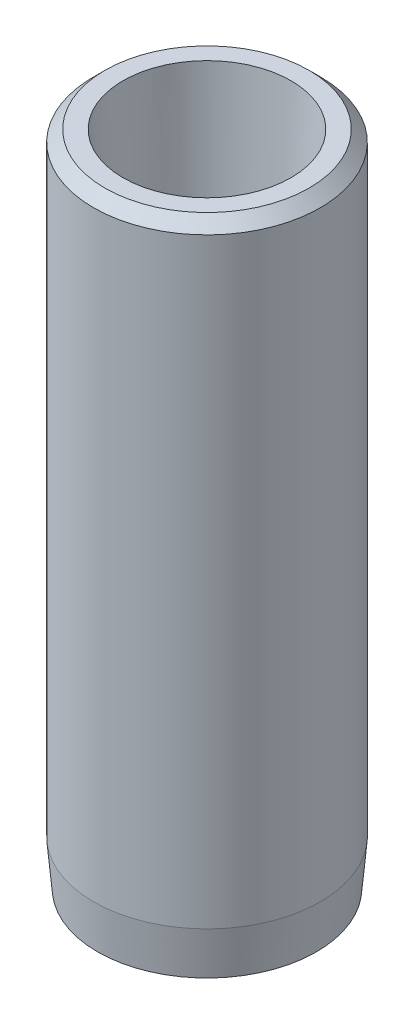
ISO-10303-21;
HEADER;
FILE_DESCRIPTION(('STEP AP214'),'2;1');
FILE_NAME('part.step','',(''),(''),'','','');
FILE_SCHEMA(('AUTOMOTIVE_DESIGN { 1 0 10303 214 1 1 1 1 }'));
ENDSEC;
DATA;
#1=APPLICATION_CONTEXT('core data for automotive mechanical design processes');
#2=APPLICATION_PROTOCOL_DEFINITION('international standard','automotive_design',2000,#1);
#3=PRODUCT_CONTEXT('',#1,'mechanical');
#4=PRODUCT('Part','Part','',(#3));
#5=PRODUCT_RELATED_PRODUCT_CATEGORY('part','',(#4));
#6=PRODUCT_DEFINITION_FORMATION('','',#4);
#7=PRODUCT_DEFINITION_CONTEXT('part definition',#1,'design');
#8=PRODUCT_DEFINITION('design','',#6,#7);
#9=PRODUCT_DEFINITION_SHAPE('','',#8);
#10=(LENGTH_UNIT() NAMED_UNIT(*) SI_UNIT(.MILLI.,.METRE.));
#11=(NAMED_UNIT(*) PLANE_ANGLE_UNIT() SI_UNIT($,.RADIAN.));
#12=(NAMED_UNIT(*) SI_UNIT($,.STERADIAN.) SOLID_ANGLE_UNIT());
#13=UNCERTAINTY_MEASURE_WITH_UNIT(LENGTH_MEASURE(1.E-05),#10,'distance_accuracy_value','');
#14=(GEOMETRIC_REPRESENTATION_CONTEXT(3) GLOBAL_UNCERTAINTY_ASSIGNED_CONTEXT((#13)) GLOBAL_UNIT_ASSIGNED_CONTEXT((#10,
#11,#12)) REPRESENTATION_CONTEXT('',''));
#15=CARTESIAN_POINT('',(0.,0.,0.));
#16=DIRECTION('',(0.,0.,1.));
#17=DIRECTION('',(1.,0.,0.));
#18=AXIS2_PLACEMENT_3D('',#15,#16,#17);
#19=CARTESIAN_POINT('',(0.,29.,0.));
#20=DIRECTION('',(0.,1.,0.));
#21=DIRECTION('',(0.,0.,1.));
#22=AXIS2_PLACEMENT_3D('',#19,#20,#21);
#23=PLANE('',#22);
#24=CARTESIAN_POINT('',(0.,29.,0.));
#25=DIRECTION('',(0.,1.,0.));
#26=DIRECTION('',(0.,0.,1.));
#27=AXIS2_PLACEMENT_3D('',#24,#25,#26);
#28=CIRCLE('',#27,4.50000000000002);
#29=CARTESIAN_POINT('',(0.,29.,4.50000000000002));
#30=VERTEX_POINT('',#29);
#31=EDGE_CURVE('E58',#30,#30,#28,.T.);
#32=ORIENTED_EDGE('',*,*,#31,.T.);
#33=EDGE_LOOP('',(#32));
#34=FACE_BOUND('',#33,.T.);
#35=CARTESIAN_POINT('',(0.,29.,0.));
#36=DIRECTION('',(0.,-1.,0.));
#37=DIRECTION('',(0.,0.,1.));
#38=AXIS2_PLACEMENT_3D('',#35,#36,#37);
#39=CIRCLE('',#38,3.70537892350978);
#40=CARTESIAN_POINT('',(0.,29.,3.70537892350978));
#41=VERTEX_POINT('',#40);
#42=CARTESIAN_POINT('',(3.70537892350978,29.,0.));
#43=VERTEX_POINT('',#42);
#44=EDGE_CURVE('E83',#41,#43,#39,.T.);
#45=ORIENTED_EDGE('',*,*,#44,.T.);
#46=CARTESIAN_POINT('',(0.,29.,0.));
#47=DIRECTION('',(0.,-1.,0.));
#48=DIRECTION('',(1.,0.,0.));
#49=AXIS2_PLACEMENT_3D('',#46,#47,#48);
#50=CIRCLE('',#49,3.70537892350978);
#51=EDGE_CURVE('E84',#43,#41,#50,.T.);
#52=ORIENTED_EDGE('',*,*,#51,.T.);
#53=EDGE_LOOP('',(#45,#52));
#54=FACE_BOUND('',#53,.T.);
#55=ADVANCED_FACE('F49',(#34,#54),#23,.T.);
#56=CARTESIAN_POINT('',(0.,0.,0.));
#57=DIRECTION('',(0.,1.,0.));
#58=DIRECTION('',(0.,0.,1.));
#59=AXIS2_PLACEMENT_3D('',#56,#57,#58);
#60=PLANE('',#59);
#61=CARTESIAN_POINT('',(0.,0.,0.));
#62=DIRECTION('',(0.,1.,0.));
#63=DIRECTION('',(0.,0.,1.));
#64=AXIS2_PLACEMENT_3D('',#61,#62,#63);
#65=CIRCLE('',#64,4.82502267294818);
#66=CARTESIAN_POINT('',(0.,0.,4.82502267294818));
#67=VERTEX_POINT('',#66);
#68=EDGE_CURVE('E102',#67,#67,#65,.F.);
#69=ORIENTED_EDGE('',*,*,#68,.T.);
#70=EDGE_LOOP('',(#69));
#71=FACE_BOUND('',#70,.T.);
#72=CARTESIAN_POINT('',(0.,0.,0.));
#73=DIRECTION('',(0.,1.,0.));
#74=DIRECTION('',(0.,0.,1.));
#75=AXIS2_PLACEMENT_3D('',#72,#73,#74);
#76=CIRCLE('',#75,2.5);
#77=CARTESIAN_POINT('',(0.,0.,2.5));
#78=VERTEX_POINT('',#77);
#79=EDGE_CURVE('E96',#78,#78,#76,.T.);
#80=ORIENTED_EDGE('',*,*,#79,.T.);
#81=EDGE_LOOP('',(#80));
#82=FACE_BOUND('',#81,.T.);
#83=ADVANCED_FACE('F119',(#71,#82),#60,.F.);
#84=CARTESIAN_POINT('',(0.,29.,0.));
#85=DIRECTION('',(0.,-1.,0.));
#86=DIRECTION('',(0.,0.,-1.));
#87=AXIS2_PLACEMENT_3D('',#84,#85,#86);
#88=CYLINDRICAL_SURFACE('',#87,5.);
#89=CARTESIAN_POINT('',(0.,28.5,0.));
#90=DIRECTION('',(0.,1.,0.));
#91=DIRECTION('',(0.,0.,1.));
#92=AXIS2_PLACEMENT_3D('',#89,#90,#91);
#93=CIRCLE('',#92,5.);
#94=CARTESIAN_POINT('',(0.,28.5,-5.));
#95=VERTEX_POINT('',#94);
#96=EDGE_CURVE('E11',#95,#95,#93,.F.);
#97=CARTESIAN_POINT('',(0.,1.99999999999977,0.));
#98=DIRECTION('',(0.,1.,0.));
#99=DIRECTION('',(0.,0.,1.));
#100=AXIS2_PLACEMENT_3D('',#97,#98,#99);
#101=CIRCLE('',#100,5.);
#102=CARTESIAN_POINT('',(0.,1.99999999999977,-5.));
#103=VERTEX_POINT('',#102);
#104=EDGE_CURVE('E99',#103,#103,#101,.T.);
#105=CARTESIAN_POINT('',(0.,28.5,-5.));
#106=CARTESIAN_POINT('',(0.,28.2239583333333,-5.));
#107=CARTESIAN_POINT('',(0.,27.9479166666667,-5.));
#108=CARTESIAN_POINT('',(0.,27.3958333333333,-5.));
#109=CARTESIAN_POINT('',(0.,27.1197916666667,-5.));
#110=CARTESIAN_POINT('',(0.,26.5677083333333,-5.));
#111=CARTESIAN_POINT('',(0.,26.2916666666667,-5.));
#112=CARTESIAN_POINT('',(0.,25.7395833333333,-5.));
#113=CARTESIAN_POINT('',(0.,25.4635416666667,-5.));
#114=CARTESIAN_POINT('',(0.,24.9114583333333,-5.));
#115=CARTESIAN_POINT('',(0.,24.6354166666666,-5.));
#116=CARTESIAN_POINT('',(0.,24.0833333333333,-5.));
#117=CARTESIAN_POINT('',(0.,23.8072916666666,-5.));
#118=CARTESIAN_POINT('',(0.,23.2552083333333,-5.));
#119=CARTESIAN_POINT('',(0.,22.9791666666666,-5.));
#120=CARTESIAN_POINT('',(0.,22.4270833333333,-5.));
#121=CARTESIAN_POINT('',(0.,22.1510416666666,-5.));
#122=CARTESIAN_POINT('',(0.,21.5989583333333,-5.));
#123=CARTESIAN_POINT('',(0.,21.3229166666666,-5.));
#124=CARTESIAN_POINT('',(0.,20.7708333333333,-5.));
#125=CARTESIAN_POINT('',(0.,20.4947916666666,-5.));
#126=CARTESIAN_POINT('',(0.,19.9427083333333,-5.));
#127=CARTESIAN_POINT('',(0.,19.6666666666666,-5.));
#128=CARTESIAN_POINT('',(0.,19.1145833333333,-5.));
#129=CARTESIAN_POINT('',(0.,18.8385416666666,-5.));
#130=CARTESIAN_POINT('',(0.,18.2864583333333,-5.));
#131=CARTESIAN_POINT('',(0.,18.0104166666666,-5.));
#132=CARTESIAN_POINT('',(0.,17.4583333333332,-5.));
#133=CARTESIAN_POINT('',(0.,17.1822916666666,-5.));
#134=CARTESIAN_POINT('',(0.,16.6302083333332,-5.));
#135=CARTESIAN_POINT('',(0.,16.3541666666666,-5.));
#136=CARTESIAN_POINT('',(0.,15.8020833333332,-5.));
#137=CARTESIAN_POINT('',(0.,15.5260416666666,-5.));
#138=CARTESIAN_POINT('',(0.,14.9739583333332,-5.));
#139=CARTESIAN_POINT('',(0.,14.6979166666666,-5.));
#140=CARTESIAN_POINT('',(0.,14.1458333333332,-5.));
#141=CARTESIAN_POINT('',(0.,13.8697916666665,-5.));
#142=CARTESIAN_POINT('',(0.,13.3177083333332,-5.));
#143=CARTESIAN_POINT('',(0.,13.0416666666665,-5.));
#144=CARTESIAN_POINT('',(0.,12.4895833333332,-5.));
#145=CARTESIAN_POINT('',(0.,12.2135416666665,-5.));
#146=CARTESIAN_POINT('',(0.,11.6614583333332,-5.));
#147=CARTESIAN_POINT('',(0.,11.3854166666665,-5.));
#148=CARTESIAN_POINT('',(0.,10.8333333333332,-5.));
#149=CARTESIAN_POINT('',(0.,10.5572916666665,-5.));
#150=CARTESIAN_POINT('',(0.,10.0052083333332,-5.));
#151=CARTESIAN_POINT('',(0.,9.7291666666665,-5.));
#152=CARTESIAN_POINT('',(0.,9.17708333333316,-5.));
#153=CARTESIAN_POINT('',(0.,8.9010416666665,-5.));
#154=CARTESIAN_POINT('',(0.,8.34895833333316,-5.));
#155=CARTESIAN_POINT('',(0.,8.07291666666649,-5.));
#156=CARTESIAN_POINT('',(0.,7.52083333333315,-5.));
#157=CARTESIAN_POINT('',(0.,7.24479166666648,-5.));
#158=CARTESIAN_POINT('',(0.,6.69270833333314,-5.));
#159=CARTESIAN_POINT('',(0.,6.41666666666647,-5.));
#160=CARTESIAN_POINT('',(0.,5.86458333333313,-5.));
#161=CARTESIAN_POINT('',(0.,5.58854166666647,-5.));
#162=CARTESIAN_POINT('',(0.,5.03645833333313,-5.));
#163=CARTESIAN_POINT('',(0.,4.76041666666646,-5.));
#164=CARTESIAN_POINT('',(0.,4.20833333333312,-5.));
#165=CARTESIAN_POINT('',(0.,3.93229166666645,-5.));
#166=CARTESIAN_POINT('',(0.,3.38020833333311,-5.));
#167=CARTESIAN_POINT('',(0.,3.10416666666644,-5.));
#168=CARTESIAN_POINT('',(0.,2.5520833333331,-5.));
#169=CARTESIAN_POINT('',(0.,2.27604166666643,-5.));
#170=CARTESIAN_POINT('',(0.,1.99999999999977,-5.));
#171=B_SPLINE_CURVE_WITH_KNOTS('',3,(#105,#106,#107,#108,#109,#110,#111,#112,#113,#114,#115,
#116,#117,#118,#119,#120,#121,#122,#123,#124,#125,#126,#127,#128,#129,#130,#131,#132,#133,#134,
#135,#136,#137,#138,#139,#140,#141,#142,#143,#144,#145,#146,#147,#148,#149,#150,#151,#152,#153,
#154,#155,#156,#157,#158,#159,#160,#161,#162,#163,#164,#165,#166,#167,#168,#169,#170),
.UNSPECIFIED.,.F.,.F.,(4,2,2,2,2,2,2,2,2,2,2,2,2,2,2,2,2,2,2,2,2,2,2,2,2,2,2,2,2,2,2,2,4),(0.,
0.828125000000009,1.65625000000002,2.48437500000002,3.31250000000003,4.14062500000004,
4.96875000000005,5.79687500000006,6.62500000000006,7.45312500000007,8.28125000000008,
9.10937500000009,9.9375000000001,10.7656250000001,11.5937500000001,12.4218750000001,
13.2500000000001,14.0781250000001,14.9062500000001,15.7343750000002,16.5625000000002,
17.3906250000002,18.2187500000002,19.0468750000002,19.8750000000002,20.7031250000002,
21.5312500000002,22.3593750000002,23.1875000000002,24.0156250000002,24.8437500000002,
25.6718750000002,26.5000000000002),.UNSPECIFIED.);
#172=EDGE_CURVE('BSEAM124',#95,#103,#171,.T.);
#173=ORIENTED_EDGE('',*,*,#96,.T.);
#174=ORIENTED_EDGE('',*,*,#104,.T.);
#175=ORIENTED_EDGE('',*,*,#172,.T.);
#176=ORIENTED_EDGE('',*,*,#172,.F.);
#177=EDGE_LOOP('',(#173,#175,#174,#176));
#178=FACE_BOUND('',#177,.T.);
#179=ADVANCED_FACE('F124',(#178),#88,.T.);
#180=CARTESIAN_POINT('',(0.,29.,0.));
#181=DIRECTION('',(0.,-1.,0.));
#182=DIRECTION('',(0.,0.,-1.));
#183=AXIS2_PLACEMENT_3D('',#180,#181,#182);
#184=CYLINDRICAL_SURFACE('',#183,2.5);
#185=CARTESIAN_POINT('',(0.,6.,0.));
#186=DIRECTION('',(0.,-1.,0.));
#187=DIRECTION('',(1.,0.,0.));
#188=AXIS2_PLACEMENT_3D('',#185,#186,#187);
#189=CIRCLE('',#188,2.5);
#190=CARTESIAN_POINT('',(2.5,6.,0.));
#191=VERTEX_POINT('',#190);
#192=CARTESIAN_POINT('',(0.,6.,2.5));
#193=VERTEX_POINT('',#192);
#194=EDGE_CURVE('E70',#191,#193,#189,.T.);
#195=ORIENTED_EDGE('',*,*,#194,.F.);
#196=CARTESIAN_POINT('',(0.,6.,0.));
#197=DIRECTION('',(0.,-1.,0.));
#198=DIRECTION('',(0.,0.,1.));
#199=AXIS2_PLACEMENT_3D('',#196,#197,#198);
#200=CIRCLE('',#199,2.5);
#201=EDGE_CURVE('E78',#193,#191,#200,.T.);
#202=ORIENTED_EDGE('',*,*,#201,.F.);
#203=EDGE_LOOP('',(#195,#202));
#204=FACE_BOUND('',#203,.T.);
#205=ORIENTED_EDGE('',*,*,#79,.F.);
#206=EDGE_LOOP('',(#205));
#207=FACE_BOUND('',#206,.T.);
#208=ADVANCED_FACE('F89',(#204,#207),#184,.F.);
#209=CARTESIAN_POINT('',(0.,6.,0.));
#210=DIRECTION('',(0.,1.,0.));
#211=DIRECTION('',(0.,0.,1.));
#212=AXIS2_PLACEMENT_3D('',#209,#210,#211);
#213=CONICAL_SURFACE('',#212,2.5,0.0523598775598228);
#214=DIRECTION('',(0.0523359562429368,0.998629534754574,0.));
#215=VECTOR('',#214,1.);
#216=CARTESIAN_POINT('',(2.5,6.,0.));
#217=LINE('',#216,#215);
#218=EDGE_CURVE('E80',#191,#43,#217,.T.);
#219=ORIENTED_EDGE('',*,*,#218,.T.);
#220=ORIENTED_EDGE('',*,*,#44,.F.);
#221=DIRECTION('',(0.,0.998629534754574,0.0523359562429368));
#222=VECTOR('',#221,1.);
#223=CARTESIAN_POINT('',(0.,6.,2.5));
#224=LINE('',#223,#222);
#225=EDGE_CURVE('E65',#193,#41,#224,.T.);
#226=ORIENTED_EDGE('',*,*,#225,.F.);
#227=ORIENTED_EDGE('',*,*,#201,.T.);
#228=EDGE_LOOP('',(#219,#220,#226,#227));
#229=FACE_BOUND('',#228,.T.);
#230=ADVANCED_FACE('F79',(#229),#213,.F.);
#231=CARTESIAN_POINT('',(0.,6.,0.));
#232=DIRECTION('',(0.,1.,0.));
#233=DIRECTION('',(0.,0.,1.));
#234=AXIS2_PLACEMENT_3D('',#231,#232,#233);
#235=CONICAL_SURFACE('',#234,2.5,0.0523598775598228);
#236=ORIENTED_EDGE('',*,*,#51,.F.);
#237=ORIENTED_EDGE('',*,*,#218,.F.);
#238=ORIENTED_EDGE('',*,*,#194,.T.);
#239=ORIENTED_EDGE('',*,*,#225,.T.);
#240=EDGE_LOOP('',(#236,#237,#238,#239));
#241=FACE_BOUND('',#240,.T.);
#242=ADVANCED_FACE('F86',(#241),#235,.F.);
#243=CARTESIAN_POINT('',(0.,1.99999999999977,0.));
#244=DIRECTION('',(0.,1.,0.));
#245=DIRECTION('',(0.,0.,1.));
#246=AXIS2_PLACEMENT_3D('',#243,#244,#245);
#247=CONICAL_SURFACE('',#246,5.,0.0872664625997142);
#248=ORIENTED_EDGE('',*,*,#68,.F.);
#249=EDGE_LOOP('',(#248));
#250=FACE_BOUND('',#249,.T.);
#251=ORIENTED_EDGE('',*,*,#104,.F.);
#252=EDGE_LOOP('',(#251));
#253=FACE_BOUND('',#252,.T.);
#254=ADVANCED_FACE('F110',(#250,#253),#247,.T.);
#255=CARTESIAN_POINT('',(0.,29.,0.));
#256=DIRECTION('',(0.,-1.,0.));
#257=DIRECTION('',(0.,0.,-1.));
#258=AXIS2_PLACEMENT_3D('',#255,#256,#257);
#259=CONICAL_SURFACE('',#258,4.50000000000002,0.785398163397445);
#260=ORIENTED_EDGE('',*,*,#96,.F.);
#261=EDGE_LOOP('',(#260));
#262=FACE_BOUND('',#261,.T.);
#263=ORIENTED_EDGE('',*,*,#31,.F.);
#264=EDGE_LOOP('',(#263));
#265=FACE_BOUND('',#264,.T.);
#266=ADVANCED_FACE('F52',(#262,#265),#259,.T.);
#267=CLOSED_SHELL('',(#55,#83,#179,#208,#230,#242,#254,#266));
#268=MANIFOLD_SOLID_BREP('B2',#267);
#269=ADVANCED_BREP_SHAPE_REPRESENTATION('',(#18,#268),#14);
#270=SHAPE_DEFINITION_REPRESENTATION(#9,#269);
ENDSEC;
END-ISO-10303-21;
